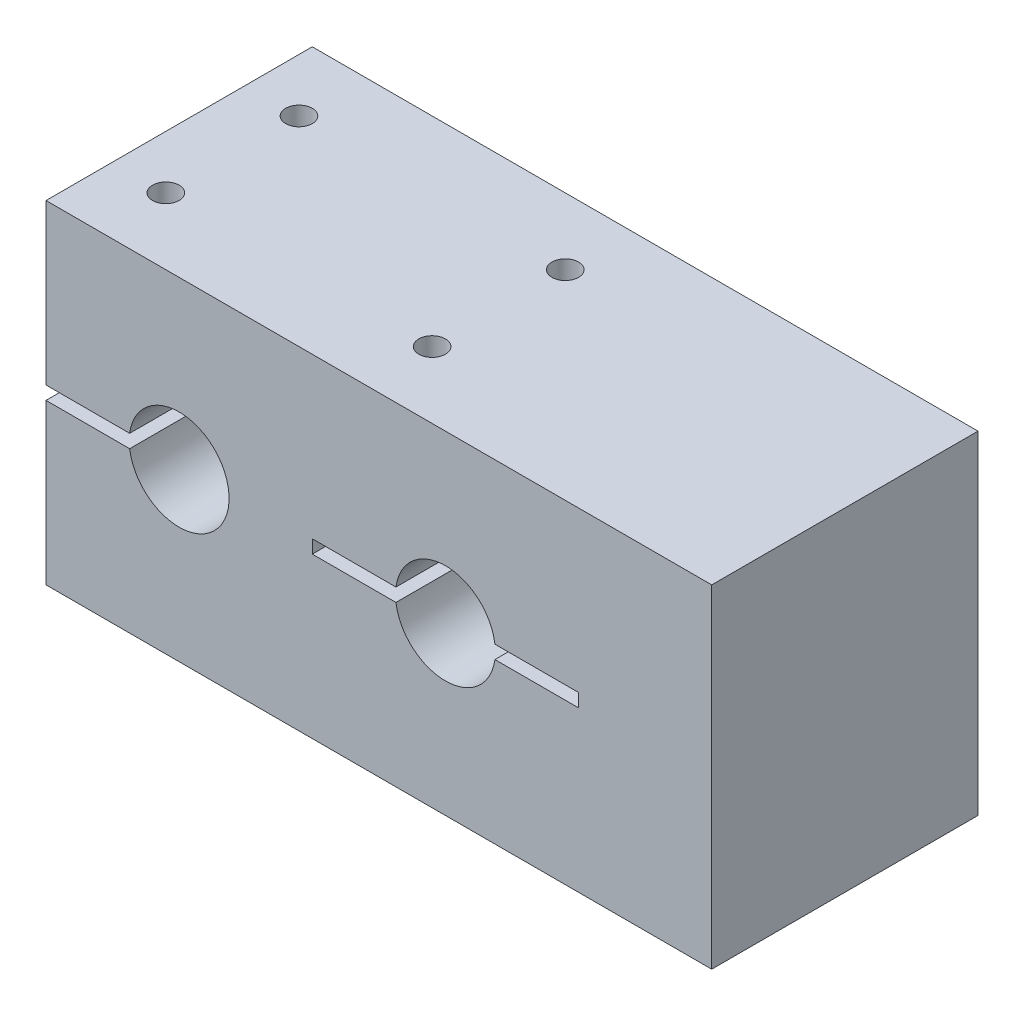
ISO-10303-21;
HEADER;
FILE_DESCRIPTION(('STEP AP214'),'2;1');
FILE_NAME('part.step','',(''),(''),'','','');
FILE_SCHEMA(('AUTOMOTIVE_DESIGN { 1 0 10303 214 1 1 1 1 }'));
ENDSEC;
DATA;
#1=APPLICATION_CONTEXT('core data for automotive mechanical design processes');
#2=APPLICATION_PROTOCOL_DEFINITION('international standard','automotive_design',2000,#1);
#3=PRODUCT_CONTEXT('',#1,'mechanical');
#4=PRODUCT('Part','Part','',(#3));
#5=PRODUCT_RELATED_PRODUCT_CATEGORY('part','',(#4));
#6=PRODUCT_DEFINITION_FORMATION('','',#4);
#7=PRODUCT_DEFINITION_CONTEXT('part definition',#1,'design');
#8=PRODUCT_DEFINITION('design','',#6,#7);
#9=PRODUCT_DEFINITION_SHAPE('','',#8);
#10=(LENGTH_UNIT() NAMED_UNIT(*) SI_UNIT(.MILLI.,.METRE.));
#11=(NAMED_UNIT(*) PLANE_ANGLE_UNIT() SI_UNIT($,.RADIAN.));
#12=(NAMED_UNIT(*) SI_UNIT($,.STERADIAN.) SOLID_ANGLE_UNIT());
#13=UNCERTAINTY_MEASURE_WITH_UNIT(LENGTH_MEASURE(1.E-05),#10,'distance_accuracy_value','');
#14=(GEOMETRIC_REPRESENTATION_CONTEXT(3) GLOBAL_UNCERTAINTY_ASSIGNED_CONTEXT((#13)) GLOBAL_UNIT_ASSIGNED_CONTEXT((#10,
#11,#12)) REPRESENTATION_CONTEXT('',''));
#15=CARTESIAN_POINT('',(0.,0.,0.));
#16=DIRECTION('',(0.,0.,1.));
#17=DIRECTION('',(1.,0.,0.));
#18=AXIS2_PLACEMENT_3D('',#15,#16,#17);
#19=CARTESIAN_POINT('',(20.,25.,40.));
#20=DIRECTION('',(0.,0.,1.));
#21=DIRECTION('',(1.,0.,0.));
#22=AXIS2_PLACEMENT_3D('',#19,#20,#21);
#23=PLANE('',#22);
#24=DIRECTION('',(0.,-1.,0.));
#25=VECTOR('',#24,1.);
#26=CARTESIAN_POINT('',(0.,0.,40.));
#27=LINE('',#26,#25);
#28=CARTESIAN_POINT('',(0.,24.,40.));
#29=VERTEX_POINT('',#28);
#30=CARTESIAN_POINT('',(0.,0.,40.));
#31=VERTEX_POINT('',#30);
#32=EDGE_CURVE('E217',#29,#31,#27,.T.);
#33=ORIENTED_EDGE('',*,*,#32,.T.);
#34=DIRECTION('',(1.,0.,0.));
#35=VECTOR('',#34,1.);
#36=CARTESIAN_POINT('',(0.,0.,40.));
#37=LINE('',#36,#35);
#38=CARTESIAN_POINT('',(100.,0.,40.));
#39=VERTEX_POINT('',#38);
#40=EDGE_CURVE('E220',#31,#39,#37,.T.);
#41=ORIENTED_EDGE('',*,*,#40,.T.);
#42=DIRECTION('',(0.,1.,0.));
#43=VECTOR('',#42,1.);
#44=CARTESIAN_POINT('',(100.,0.,40.));
#45=LINE('',#44,#43);
#46=CARTESIAN_POINT('',(100.,50.,40.));
#47=VERTEX_POINT('',#46);
#48=EDGE_CURVE('E223',#39,#47,#45,.T.);
#49=ORIENTED_EDGE('',*,*,#48,.T.);
#50=DIRECTION('',(-1.,0.,0.));
#51=VECTOR('',#50,1.);
#52=CARTESIAN_POINT('',(0.,50.,40.));
#53=LINE('',#52,#51);
#54=CARTESIAN_POINT('',(0.,50.,40.));
#55=VERTEX_POINT('',#54);
#56=EDGE_CURVE('E225',#47,#55,#53,.T.);
#57=ORIENTED_EDGE('',*,*,#56,.T.);
#58=DIRECTION('',(0.,-1.,0.));
#59=VECTOR('',#58,1.);
#60=CARTESIAN_POINT('',(0.,26.,40.));
#61=LINE('',#60,#59);
#62=CARTESIAN_POINT('',(0.,26.,40.));
#63=VERTEX_POINT('',#62);
#64=EDGE_CURVE('E227',#55,#63,#61,.T.);
#65=ORIENTED_EDGE('',*,*,#64,.T.);
#66=DIRECTION('',(1.,0.,0.));
#67=VECTOR('',#66,1.);
#68=CARTESIAN_POINT('',(0.,26.,40.));
#69=LINE('',#68,#67);
#70=CARTESIAN_POINT('',(12.5669656263407,26.,40.));
#71=VERTEX_POINT('',#70);
#72=EDGE_CURVE('E229',#63,#71,#69,.T.);
#73=ORIENTED_EDGE('',*,*,#72,.T.);
#74=CARTESIAN_POINT('',(20.,25.,40.));
#75=DIRECTION('',(0.,0.,-1.));
#76=DIRECTION('',(1.,0.,0.));
#77=AXIS2_PLACEMENT_3D('',#74,#75,#76);
#78=CIRCLE('',#77,7.5);
#79=CARTESIAN_POINT('',(12.5669656263407,24.,40.));
#80=VERTEX_POINT('',#79);
#81=EDGE_CURVE('E231',#71,#80,#78,.T.);
#82=ORIENTED_EDGE('',*,*,#81,.T.);
#83=DIRECTION('',(-1.,0.,0.));
#84=VECTOR('',#83,1.);
#85=CARTESIAN_POINT('',(0.,24.,40.));
#86=LINE('',#85,#84);
#87=EDGE_CURVE('E233',#80,#29,#86,.T.);
#88=ORIENTED_EDGE('',*,*,#87,.T.);
#89=EDGE_LOOP('',(#33,#41,#49,#57,#65,#73,#82,#88));
#90=FACE_BOUND('',#89,.T.);
#91=DIRECTION('',(1.,0.,0.));
#92=VECTOR('',#91,1.);
#93=CARTESIAN_POINT('',(67.4330343736593,24.,40.));
#94=LINE('',#93,#92);
#95=CARTESIAN_POINT('',(67.4330343736593,24.,40.));
#96=VERTEX_POINT('',#95);
#97=CARTESIAN_POINT('',(80.,24.,40.));
#98=VERTEX_POINT('',#97);
#99=EDGE_CURVE('E158',#96,#98,#94,.T.);
#100=ORIENTED_EDGE('',*,*,#99,.F.);
#101=CARTESIAN_POINT('',(60.,25.,40.));
#102=DIRECTION('',(0.,0.,1.));
#103=DIRECTION('',(1.,0.,0.));
#104=AXIS2_PLACEMENT_3D('',#101,#102,#103);
#105=CIRCLE('',#104,7.50000000000001);
#106=CARTESIAN_POINT('',(52.5669656263408,24.,40.));
#107=VERTEX_POINT('',#106);
#108=EDGE_CURVE('E150',#107,#96,#105,.T.);
#109=ORIENTED_EDGE('',*,*,#108,.F.);
#110=DIRECTION('',(1.,0.,0.));
#111=VECTOR('',#110,1.);
#112=CARTESIAN_POINT('',(40.,24.,40.));
#113=LINE('',#112,#111);
#114=CARTESIAN_POINT('',(40.,24.,40.));
#115=VERTEX_POINT('',#114);
#116=EDGE_CURVE('E184',#115,#107,#113,.T.);
#117=ORIENTED_EDGE('',*,*,#116,.F.);
#118=DIRECTION('',(0.,-1.,0.));
#119=VECTOR('',#118,1.);
#120=CARTESIAN_POINT('',(40.,26.,40.));
#121=LINE('',#120,#119);
#122=CARTESIAN_POINT('',(40.,26.,40.));
#123=VERTEX_POINT('',#122);
#124=EDGE_CURVE('E182',#123,#115,#121,.T.);
#125=ORIENTED_EDGE('',*,*,#124,.F.);
#126=DIRECTION('',(-1.,0.,0.));
#127=VECTOR('',#126,1.);
#128=CARTESIAN_POINT('',(52.5669656263407,26.,40.));
#129=LINE('',#128,#127);
#130=CARTESIAN_POINT('',(52.5669656263407,26.,40.));
#131=VERTEX_POINT('',#130);
#132=EDGE_CURVE('E180',#131,#123,#129,.T.);
#133=ORIENTED_EDGE('',*,*,#132,.F.);
#134=CARTESIAN_POINT('',(60.,25.,40.));
#135=DIRECTION('',(0.,0.,1.));
#136=DIRECTION('',(1.,0.,0.));
#137=AXIS2_PLACEMENT_3D('',#134,#135,#136);
#138=CIRCLE('',#137,7.50000000000001);
#139=CARTESIAN_POINT('',(67.4330343736593,26.,40.));
#140=VERTEX_POINT('',#139);
#141=EDGE_CURVE('E178',#140,#131,#138,.T.);
#142=ORIENTED_EDGE('',*,*,#141,.F.);
#143=DIRECTION('',(-1.,0.,0.));
#144=VECTOR('',#143,1.);
#145=CARTESIAN_POINT('',(80.,26.,40.));
#146=LINE('',#145,#144);
#147=CARTESIAN_POINT('',(80.,26.,40.));
#148=VERTEX_POINT('',#147);
#149=EDGE_CURVE('E173',#148,#140,#146,.T.);
#150=ORIENTED_EDGE('',*,*,#149,.F.);
#151=DIRECTION('',(0.,1.,0.));
#152=VECTOR('',#151,1.);
#153=CARTESIAN_POINT('',(80.,24.,40.));
#154=LINE('',#153,#152);
#155=EDGE_CURVE('E171',#98,#148,#154,.T.);
#156=ORIENTED_EDGE('',*,*,#155,.F.);
#157=EDGE_LOOP('',(#100,#109,#117,#125,#133,#142,#150,#156));
#158=FACE_BOUND('',#157,.T.);
#159=ADVANCED_FACE('F35',(#90,#158),#23,.T.);
#160=CARTESIAN_POINT('',(20.,25.,0.));
#161=DIRECTION('',(0.,0.,1.));
#162=DIRECTION('',(1.,0.,0.));
#163=AXIS2_PLACEMENT_3D('',#160,#161,#162);
#164=PLANE('',#163);
#165=DIRECTION('',(0.,-1.,0.));
#166=VECTOR('',#165,1.);
#167=CARTESIAN_POINT('',(0.,0.,0.));
#168=LINE('',#167,#166);
#169=CARTESIAN_POINT('',(0.,24.,0.));
#170=VERTEX_POINT('',#169);
#171=CARTESIAN_POINT('',(0.,0.,0.));
#172=VERTEX_POINT('',#171);
#173=EDGE_CURVE('E166',#170,#172,#168,.T.);
#174=ORIENTED_EDGE('',*,*,#173,.F.);
#175=DIRECTION('',(-1.,0.,0.));
#176=VECTOR('',#175,1.);
#177=CARTESIAN_POINT('',(0.,24.,0.));
#178=LINE('',#177,#176);
#179=CARTESIAN_POINT('',(12.5669656263407,24.,0.));
#180=VERTEX_POINT('',#179);
#181=EDGE_CURVE('E221',#180,#170,#178,.T.);
#182=ORIENTED_EDGE('',*,*,#181,.F.);
#183=CARTESIAN_POINT('',(20.,25.,0.));
#184=DIRECTION('',(0.,0.,-1.));
#185=DIRECTION('',(1.,0.,0.));
#186=AXIS2_PLACEMENT_3D('',#183,#184,#185);
#187=CIRCLE('',#186,7.5);
#188=CARTESIAN_POINT('',(12.5669656263407,26.,0.));
#189=VERTEX_POINT('',#188);
#190=EDGE_CURVE('E249',#189,#180,#187,.T.);
#191=ORIENTED_EDGE('',*,*,#190,.F.);
#192=DIRECTION('',(1.,0.,0.));
#193=VECTOR('',#192,1.);
#194=CARTESIAN_POINT('',(0.,26.,0.));
#195=LINE('',#194,#193);
#196=CARTESIAN_POINT('',(0.,26.,0.));
#197=VERTEX_POINT('',#196);
#198=EDGE_CURVE('E247',#197,#189,#195,.T.);
#199=ORIENTED_EDGE('',*,*,#198,.F.);
#200=DIRECTION('',(0.,-1.,0.));
#201=VECTOR('',#200,1.);
#202=CARTESIAN_POINT('',(0.,26.,0.));
#203=LINE('',#202,#201);
#204=CARTESIAN_POINT('',(0.,50.,0.));
#205=VERTEX_POINT('',#204);
#206=EDGE_CURVE('E245',#205,#197,#203,.T.);
#207=ORIENTED_EDGE('',*,*,#206,.F.);
#208=DIRECTION('',(-1.,0.,0.));
#209=VECTOR('',#208,1.);
#210=CARTESIAN_POINT('',(0.,50.,0.));
#211=LINE('',#210,#209);
#212=CARTESIAN_POINT('',(100.,50.,0.));
#213=VERTEX_POINT('',#212);
#214=EDGE_CURVE('E243',#213,#205,#211,.T.);
#215=ORIENTED_EDGE('',*,*,#214,.F.);
#216=DIRECTION('',(0.,1.,0.));
#217=VECTOR('',#216,1.);
#218=CARTESIAN_POINT('',(100.,34.,0.));
#219=LINE('',#218,#217);
#220=CARTESIAN_POINT('',(100.,0.,0.));
#221=VERTEX_POINT('',#220);
#222=EDGE_CURVE('E241',#221,#213,#219,.T.);
#223=ORIENTED_EDGE('',*,*,#222,.F.);
#224=DIRECTION('',(1.,0.,0.));
#225=VECTOR('',#224,1.);
#226=CARTESIAN_POINT('',(0.,0.,0.));
#227=LINE('',#226,#225);
#228=EDGE_CURVE('E238',#172,#221,#227,.T.);
#229=ORIENTED_EDGE('',*,*,#228,.F.);
#230=EDGE_LOOP('',(#174,#182,#191,#199,#207,#215,#223,#229));
#231=FACE_BOUND('',#230,.T.);
#232=CARTESIAN_POINT('',(60.,25.,0.));
#233=DIRECTION('',(0.,0.,1.));
#234=DIRECTION('',(1.,0.,0.));
#235=AXIS2_PLACEMENT_3D('',#232,#233,#234);
#236=CIRCLE('',#235,7.50000000000001);
#237=CARTESIAN_POINT('',(52.5669656263408,24.,0.));
#238=VERTEX_POINT('',#237);
#239=CARTESIAN_POINT('',(67.4330343736593,24.,0.));
#240=VERTEX_POINT('',#239);
#241=EDGE_CURVE('E60',#238,#240,#236,.T.);
#242=ORIENTED_EDGE('',*,*,#241,.T.);
#243=DIRECTION('',(1.,0.,0.));
#244=VECTOR('',#243,1.);
#245=CARTESIAN_POINT('',(67.4330343736593,24.,0.));
#246=LINE('',#245,#244);
#247=CARTESIAN_POINT('',(80.,24.,0.));
#248=VERTEX_POINT('',#247);
#249=EDGE_CURVE('E165',#240,#248,#246,.T.);
#250=ORIENTED_EDGE('',*,*,#249,.T.);
#251=DIRECTION('',(0.,1.,0.));
#252=VECTOR('',#251,1.);
#253=CARTESIAN_POINT('',(80.,24.,0.));
#254=LINE('',#253,#252);
#255=CARTESIAN_POINT('',(80.,26.,0.));
#256=VERTEX_POINT('',#255);
#257=EDGE_CURVE('E189',#248,#256,#254,.T.);
#258=ORIENTED_EDGE('',*,*,#257,.T.);
#259=DIRECTION('',(-1.,0.,0.));
#260=VECTOR('',#259,1.);
#261=CARTESIAN_POINT('',(80.,26.,0.));
#262=LINE('',#261,#260);
#263=CARTESIAN_POINT('',(67.4330343736593,26.,0.));
#264=VERTEX_POINT('',#263);
#265=EDGE_CURVE('E192',#256,#264,#262,.T.);
#266=ORIENTED_EDGE('',*,*,#265,.T.);
#267=CARTESIAN_POINT('',(60.,25.,0.));
#268=DIRECTION('',(0.,0.,1.));
#269=DIRECTION('',(1.,0.,0.));
#270=AXIS2_PLACEMENT_3D('',#267,#268,#269);
#271=CIRCLE('',#270,7.50000000000001);
#272=CARTESIAN_POINT('',(52.5669656263407,26.,0.));
#273=VERTEX_POINT('',#272);
#274=EDGE_CURVE('E195',#264,#273,#271,.T.);
#275=ORIENTED_EDGE('',*,*,#274,.T.);
#276=DIRECTION('',(-1.,0.,0.));
#277=VECTOR('',#276,1.);
#278=CARTESIAN_POINT('',(52.5669656263407,26.,0.));
#279=LINE('',#278,#277);
#280=CARTESIAN_POINT('',(40.,26.,0.));
#281=VERTEX_POINT('',#280);
#282=EDGE_CURVE('E198',#273,#281,#279,.T.);
#283=ORIENTED_EDGE('',*,*,#282,.T.);
#284=DIRECTION('',(0.,-1.,0.));
#285=VECTOR('',#284,1.);
#286=CARTESIAN_POINT('',(40.,26.,0.));
#287=LINE('',#286,#285);
#288=CARTESIAN_POINT('',(40.,24.,0.));
#289=VERTEX_POINT('',#288);
#290=EDGE_CURVE('E201',#281,#289,#287,.T.);
#291=ORIENTED_EDGE('',*,*,#290,.T.);
#292=DIRECTION('',(1.,0.,0.));
#293=VECTOR('',#292,1.);
#294=CARTESIAN_POINT('',(40.,24.,0.));
#295=LINE('',#294,#293);
#296=EDGE_CURVE('E159',#289,#238,#295,.T.);
#297=ORIENTED_EDGE('',*,*,#296,.T.);
#298=EDGE_LOOP('',(#242,#250,#258,#266,#275,#283,#291,#297));
#299=FACE_BOUND('',#298,.T.);
#300=ADVANCED_FACE('F333',(#231,#299),#164,.F.);
#301=CARTESIAN_POINT('',(0.,0.,40.));
#302=DIRECTION('',(1.,0.,0.));
#303=DIRECTION('',(0.,1.,0.));
#304=AXIS2_PLACEMENT_3D('',#301,#302,#303);
#305=PLANE('',#304);
#306=ORIENTED_EDGE('',*,*,#173,.T.);
#307=DIRECTION('',(0.,0.,-1.));
#308=VECTOR('',#307,1.);
#309=CARTESIAN_POINT('',(0.,0.,40.));
#310=LINE('',#309,#308);
#311=EDGE_CURVE('E11',#31,#172,#310,.T.);
#312=ORIENTED_EDGE('',*,*,#311,.F.);
#313=ORIENTED_EDGE('',*,*,#32,.F.);
#314=DIRECTION('',(0.,0.,-1.));
#315=VECTOR('',#314,1.);
#316=CARTESIAN_POINT('',(0.,24.,40.));
#317=LINE('',#316,#315);
#318=EDGE_CURVE('E235',#29,#170,#317,.T.);
#319=ORIENTED_EDGE('',*,*,#318,.T.);
#320=EDGE_LOOP('',(#306,#312,#313,#319));
#321=FACE_BOUND('',#320,.T.);
#322=ADVANCED_FACE('F37',(#321),#305,.F.);
#323=CARTESIAN_POINT('',(0.,0.,40.));
#324=DIRECTION('',(0.,1.,0.));
#325=DIRECTION('',(0.,0.,1.));
#326=AXIS2_PLACEMENT_3D('',#323,#324,#325);
#327=PLANE('',#326);
#328=CARTESIAN_POINT('',(48.,0.,10.));
#329=DIRECTION('',(0.,-1.,0.));
#330=DIRECTION('',(0.,0.,-1.));
#331=AXIS2_PLACEMENT_3D('',#328,#329,#330);
#332=CIRCLE('',#331,2.);
#333=CARTESIAN_POINT('',(48.,0.,8.));
#334=VERTEX_POINT('',#333);
#335=EDGE_CURVE('E376',#334,#334,#332,.T.);
#336=ORIENTED_EDGE('',*,*,#335,.F.);
#337=EDGE_LOOP('',(#336));
#338=FACE_BOUND('',#337,.T.);
#339=CARTESIAN_POINT('',(48.,0.,30.));
#340=DIRECTION('',(0.,-1.,0.));
#341=DIRECTION('',(0.,0.,-1.));
#342=AXIS2_PLACEMENT_3D('',#339,#340,#341);
#343=CIRCLE('',#342,2.);
#344=CARTESIAN_POINT('',(48.,0.,28.));
#345=VERTEX_POINT('',#344);
#346=EDGE_CURVE('E289',#345,#345,#343,.T.);
#347=ORIENTED_EDGE('',*,*,#346,.F.);
#348=EDGE_LOOP('',(#347));
#349=FACE_BOUND('',#348,.T.);
#350=CARTESIAN_POINT('',(8.,0.,10.));
#351=DIRECTION('',(0.,-1.,0.));
#352=DIRECTION('',(0.,0.,-1.));
#353=AXIS2_PLACEMENT_3D('',#350,#351,#352);
#354=CIRCLE('',#353,2.);
#355=CARTESIAN_POINT('',(8.,0.,8.));
#356=VERTEX_POINT('',#355);
#357=EDGE_CURVE('E286',#356,#356,#354,.T.);
#358=ORIENTED_EDGE('',*,*,#357,.F.);
#359=EDGE_LOOP('',(#358));
#360=FACE_BOUND('',#359,.T.);
#361=CARTESIAN_POINT('',(8.,0.,30.));
#362=DIRECTION('',(0.,-1.,0.));
#363=DIRECTION('',(0.,0.,-1.));
#364=AXIS2_PLACEMENT_3D('',#361,#362,#363);
#365=CIRCLE('',#364,2.);
#366=CARTESIAN_POINT('',(8.,0.,28.));
#367=VERTEX_POINT('',#366);
#368=EDGE_CURVE('E305',#367,#367,#365,.T.);
#369=ORIENTED_EDGE('',*,*,#368,.F.);
#370=EDGE_LOOP('',(#369));
#371=FACE_BOUND('',#370,.T.);
#372=ORIENTED_EDGE('',*,*,#228,.T.);
#373=DIRECTION('',(0.,0.,-1.));
#374=VECTOR('',#373,1.);
#375=CARTESIAN_POINT('',(100.,0.,40.));
#376=LINE('',#375,#374);
#377=EDGE_CURVE('E44',#39,#221,#376,.T.);
#378=ORIENTED_EDGE('',*,*,#377,.F.);
#379=ORIENTED_EDGE('',*,*,#40,.F.);
#380=ORIENTED_EDGE('',*,*,#311,.T.);
#381=EDGE_LOOP('',(#372,#378,#379,#380));
#382=FACE_BOUND('',#381,.T.);
#383=ADVANCED_FACE('F365',(#338,#349,#360,#371,#382),#327,.F.);
#384=CARTESIAN_POINT('',(100.,34.,40.));
#385=DIRECTION('',(-1.,0.,0.));
#386=DIRECTION('',(0.,0.,1.));
#387=AXIS2_PLACEMENT_3D('',#384,#385,#386);
#388=PLANE('',#387);
#389=ORIENTED_EDGE('',*,*,#222,.T.);
#390=DIRECTION('',(0.,0.,-1.));
#391=VECTOR('',#390,1.);
#392=CARTESIAN_POINT('',(100.,50.,40.));
#393=LINE('',#392,#391);
#394=EDGE_CURVE('E266',#47,#213,#393,.T.);
#395=ORIENTED_EDGE('',*,*,#394,.F.);
#396=ORIENTED_EDGE('',*,*,#48,.F.);
#397=ORIENTED_EDGE('',*,*,#377,.T.);
#398=EDGE_LOOP('',(#389,#395,#396,#397));
#399=FACE_BOUND('',#398,.T.);
#400=ADVANCED_FACE('F362',(#399),#388,.F.);
#401=CARTESIAN_POINT('',(0.,50.,40.));
#402=DIRECTION('',(0.,-1.,0.));
#403=DIRECTION('',(0.,0.,-1.));
#404=AXIS2_PLACEMENT_3D('',#401,#402,#403);
#405=PLANE('',#404);
#406=CARTESIAN_POINT('',(48.,50.,10.));
#407=DIRECTION('',(0.,-1.,0.));
#408=DIRECTION('',(0.,0.,-1.));
#409=AXIS2_PLACEMENT_3D('',#406,#407,#408);
#410=CIRCLE('',#409,2.);
#411=CARTESIAN_POINT('',(48.,50.,8.));
#412=VERTEX_POINT('',#411);
#413=EDGE_CURVE('E451',#412,#412,#410,.T.);
#414=ORIENTED_EDGE('',*,*,#413,.T.);
#415=EDGE_LOOP('',(#414));
#416=FACE_BOUND('',#415,.T.);
#417=CARTESIAN_POINT('',(48.,50.,30.));
#418=DIRECTION('',(0.,-1.,0.));
#419=DIRECTION('',(0.,0.,-1.));
#420=AXIS2_PLACEMENT_3D('',#417,#418,#419);
#421=CIRCLE('',#420,2.);
#422=CARTESIAN_POINT('',(48.,50.,28.));
#423=VERTEX_POINT('',#422);
#424=EDGE_CURVE('E282',#423,#423,#421,.T.);
#425=ORIENTED_EDGE('',*,*,#424,.T.);
#426=EDGE_LOOP('',(#425));
#427=FACE_BOUND('',#426,.T.);
#428=CARTESIAN_POINT('',(8.,50.,10.));
#429=DIRECTION('',(0.,-1.,0.));
#430=DIRECTION('',(0.,0.,-1.));
#431=AXIS2_PLACEMENT_3D('',#428,#429,#430);
#432=CIRCLE('',#431,2.);
#433=CARTESIAN_POINT('',(8.,50.,8.));
#434=VERTEX_POINT('',#433);
#435=EDGE_CURVE('E278',#434,#434,#432,.T.);
#436=ORIENTED_EDGE('',*,*,#435,.T.);
#437=EDGE_LOOP('',(#436));
#438=FACE_BOUND('',#437,.T.);
#439=CARTESIAN_POINT('',(8.,50.,30.));
#440=DIRECTION('',(0.,-1.,0.));
#441=DIRECTION('',(0.,0.,-1.));
#442=AXIS2_PLACEMENT_3D('',#439,#440,#441);
#443=CIRCLE('',#442,2.);
#444=CARTESIAN_POINT('',(8.,50.,28.));
#445=VERTEX_POINT('',#444);
#446=EDGE_CURVE('E274',#445,#445,#443,.T.);
#447=ORIENTED_EDGE('',*,*,#446,.T.);
#448=EDGE_LOOP('',(#447));
#449=FACE_BOUND('',#448,.T.);
#450=ORIENTED_EDGE('',*,*,#214,.T.);
#451=DIRECTION('',(0.,0.,-1.));
#452=VECTOR('',#451,1.);
#453=CARTESIAN_POINT('',(0.,50.,40.));
#454=LINE('',#453,#452);
#455=EDGE_CURVE('E263',#55,#205,#454,.T.);
#456=ORIENTED_EDGE('',*,*,#455,.F.);
#457=ORIENTED_EDGE('',*,*,#56,.F.);
#458=ORIENTED_EDGE('',*,*,#394,.T.);
#459=EDGE_LOOP('',(#450,#456,#457,#458));
#460=FACE_BOUND('',#459,.T.);
#461=ADVANCED_FACE('F358',(#416,#427,#438,#449,#460),#405,.F.);
#462=CARTESIAN_POINT('',(0.,26.,40.));
#463=DIRECTION('',(1.,0.,0.));
#464=DIRECTION('',(0.,0.,-1.));
#465=AXIS2_PLACEMENT_3D('',#462,#463,#464);
#466=PLANE('',#465);
#467=ORIENTED_EDGE('',*,*,#206,.T.);
#468=DIRECTION('',(0.,0.,-1.));
#469=VECTOR('',#468,1.);
#470=CARTESIAN_POINT('',(0.,26.,40.));
#471=LINE('',#470,#469);
#472=EDGE_CURVE('E260',#63,#197,#471,.T.);
#473=ORIENTED_EDGE('',*,*,#472,.F.);
#474=ORIENTED_EDGE('',*,*,#64,.F.);
#475=ORIENTED_EDGE('',*,*,#455,.T.);
#476=EDGE_LOOP('',(#467,#473,#474,#475));
#477=FACE_BOUND('',#476,.T.);
#478=ADVANCED_FACE('F354',(#477),#466,.F.);
#479=CARTESIAN_POINT('',(0.,26.,40.));
#480=DIRECTION('',(0.,1.,0.));
#481=DIRECTION('',(0.,0.,1.));
#482=AXIS2_PLACEMENT_3D('',#479,#480,#481);
#483=PLANE('',#482);
#484=CARTESIAN_POINT('',(8.,26.,10.));
#485=DIRECTION('',(0.,1.,0.));
#486=DIRECTION('',(0.,0.,1.));
#487=AXIS2_PLACEMENT_3D('',#484,#485,#486);
#488=CIRCLE('',#487,2.);
#489=CARTESIAN_POINT('',(8.,26.,12.));
#490=VERTEX_POINT('',#489);
#491=EDGE_CURVE('E277',#490,#490,#488,.T.);
#492=ORIENTED_EDGE('',*,*,#491,.T.);
#493=EDGE_LOOP('',(#492));
#494=FACE_BOUND('',#493,.T.);
#495=CARTESIAN_POINT('',(8.,26.,30.));
#496=DIRECTION('',(0.,1.,0.));
#497=DIRECTION('',(0.,0.,1.));
#498=AXIS2_PLACEMENT_3D('',#495,#496,#497);
#499=CIRCLE('',#498,2.);
#500=CARTESIAN_POINT('',(8.,26.,32.));
#501=VERTEX_POINT('',#500);
#502=EDGE_CURVE('E187',#501,#501,#499,.T.);
#503=ORIENTED_EDGE('',*,*,#502,.T.);
#504=EDGE_LOOP('',(#503));
#505=FACE_BOUND('',#504,.T.);
#506=ORIENTED_EDGE('',*,*,#198,.T.);
#507=DIRECTION('',(0.,0.,-1.));
#508=VECTOR('',#507,1.);
#509=CARTESIAN_POINT('',(12.5669656263407,26.,40.));
#510=LINE('',#509,#508);
#511=EDGE_CURVE('E257',#71,#189,#510,.T.);
#512=ORIENTED_EDGE('',*,*,#511,.F.);
#513=ORIENTED_EDGE('',*,*,#72,.F.);
#514=ORIENTED_EDGE('',*,*,#472,.T.);
#515=EDGE_LOOP('',(#506,#512,#513,#514));
#516=FACE_BOUND('',#515,.T.);
#517=ADVANCED_FACE('F312',(#494,#505,#516),#483,.F.);
#518=CARTESIAN_POINT('',(20.,25.,40.));
#519=DIRECTION('',(0.,0.,-1.));
#520=DIRECTION('',(-1.,0.,0.));
#521=AXIS2_PLACEMENT_3D('',#518,#519,#520);
#522=CYLINDRICAL_SURFACE('',#521,7.5);
#523=ORIENTED_EDGE('',*,*,#190,.T.);
#524=DIRECTION('',(0.,0.,-1.));
#525=VECTOR('',#524,1.);
#526=CARTESIAN_POINT('',(12.5669656263407,24.,40.));
#527=LINE('',#526,#525);
#528=EDGE_CURVE('E254',#80,#180,#527,.T.);
#529=ORIENTED_EDGE('',*,*,#528,.F.);
#530=ORIENTED_EDGE('',*,*,#81,.F.);
#531=ORIENTED_EDGE('',*,*,#511,.T.);
#532=EDGE_LOOP('',(#523,#529,#530,#531));
#533=FACE_BOUND('',#532,.T.);
#534=ADVANCED_FACE('F347',(#533),#522,.F.);
#535=CARTESIAN_POINT('',(0.,24.,40.));
#536=DIRECTION('',(0.,-1.,0.));
#537=DIRECTION('',(0.,0.,-1.));
#538=AXIS2_PLACEMENT_3D('',#535,#536,#537);
#539=PLANE('',#538);
#540=CARTESIAN_POINT('',(8.,24.,10.));
#541=DIRECTION('',(0.,-1.,0.));
#542=DIRECTION('',(0.,0.,-1.));
#543=AXIS2_PLACEMENT_3D('',#540,#541,#542);
#544=CIRCLE('',#543,2.);
#545=CARTESIAN_POINT('',(8.,24.,8.));
#546=VERTEX_POINT('',#545);
#547=EDGE_CURVE('E275',#546,#546,#544,.T.);
#548=ORIENTED_EDGE('',*,*,#547,.T.);
#549=EDGE_LOOP('',(#548));
#550=FACE_BOUND('',#549,.T.);
#551=CARTESIAN_POINT('',(8.,24.,30.));
#552=DIRECTION('',(0.,-1.,0.));
#553=DIRECTION('',(0.,0.,-1.));
#554=AXIS2_PLACEMENT_3D('',#551,#552,#553);
#555=CIRCLE('',#554,2.);
#556=CARTESIAN_POINT('',(8.,24.,28.));
#557=VERTEX_POINT('',#556);
#558=EDGE_CURVE('E271',#557,#557,#555,.T.);
#559=ORIENTED_EDGE('',*,*,#558,.T.);
#560=EDGE_LOOP('',(#559));
#561=FACE_BOUND('',#560,.T.);
#562=ORIENTED_EDGE('',*,*,#181,.T.);
#563=ORIENTED_EDGE('',*,*,#318,.F.);
#564=ORIENTED_EDGE('',*,*,#87,.F.);
#565=ORIENTED_EDGE('',*,*,#528,.T.);
#566=EDGE_LOOP('',(#562,#563,#564,#565));
#567=FACE_BOUND('',#566,.T.);
#568=ADVANCED_FACE('F344',(#550,#561,#567),#539,.F.);
#569=CARTESIAN_POINT('',(60.,25.,40.));
#570=DIRECTION('',(0.,0.,-1.));
#571=DIRECTION('',(-1.,0.,0.));
#572=AXIS2_PLACEMENT_3D('',#569,#570,#571);
#573=CYLINDRICAL_SURFACE('',#572,7.50000000000001);
#574=ORIENTED_EDGE('',*,*,#241,.F.);
#575=DIRECTION('',(0.,0.,-1.));
#576=VECTOR('',#575,1.);
#577=CARTESIAN_POINT('',(52.5669656263408,24.,40.));
#578=LINE('',#577,#576);
#579=EDGE_CURVE('E154',#107,#238,#578,.T.);
#580=ORIENTED_EDGE('',*,*,#579,.F.);
#581=ORIENTED_EDGE('',*,*,#108,.T.);
#582=DIRECTION('',(0.,0.,-1.));
#583=VECTOR('',#582,1.);
#584=CARTESIAN_POINT('',(67.4330343736593,24.,40.));
#585=LINE('',#584,#583);
#586=EDGE_CURVE('E153',#96,#240,#585,.T.);
#587=ORIENTED_EDGE('',*,*,#586,.T.);
#588=EDGE_LOOP('',(#574,#580,#581,#587));
#589=FACE_BOUND('',#588,.T.);
#590=ADVANCED_FACE('F152',(#589),#573,.F.);
#591=CARTESIAN_POINT('',(67.4330343736593,24.,40.));
#592=DIRECTION('',(0.,1.,0.));
#593=DIRECTION('',(0.,0.,1.));
#594=AXIS2_PLACEMENT_3D('',#591,#592,#593);
#595=PLANE('',#594);
#596=ORIENTED_EDGE('',*,*,#249,.F.);
#597=ORIENTED_EDGE('',*,*,#586,.F.);
#598=ORIENTED_EDGE('',*,*,#99,.T.);
#599=DIRECTION('',(0.,0.,-1.));
#600=VECTOR('',#599,1.);
#601=CARTESIAN_POINT('',(80.,24.,40.));
#602=LINE('',#601,#600);
#603=EDGE_CURVE('E167',#98,#248,#602,.T.);
#604=ORIENTED_EDGE('',*,*,#603,.T.);
#605=EDGE_LOOP('',(#596,#597,#598,#604));
#606=FACE_BOUND('',#605,.T.);
#607=ADVANCED_FACE('F162',(#606),#595,.T.);
#608=CARTESIAN_POINT('',(80.,24.,40.));
#609=DIRECTION('',(-1.,0.,0.));
#610=DIRECTION('',(0.,0.,1.));
#611=AXIS2_PLACEMENT_3D('',#608,#609,#610);
#612=PLANE('',#611);
#613=ORIENTED_EDGE('',*,*,#257,.F.);
#614=ORIENTED_EDGE('',*,*,#603,.F.);
#615=ORIENTED_EDGE('',*,*,#155,.T.);
#616=DIRECTION('',(0.,0.,-1.));
#617=VECTOR('',#616,1.);
#618=CARTESIAN_POINT('',(80.,26.,40.));
#619=LINE('',#618,#617);
#620=EDGE_CURVE('E214',#148,#256,#619,.T.);
#621=ORIENTED_EDGE('',*,*,#620,.T.);
#622=EDGE_LOOP('',(#613,#614,#615,#621));
#623=FACE_BOUND('',#622,.T.);
#624=ADVANCED_FACE('F428',(#623),#612,.T.);
#625=CARTESIAN_POINT('',(80.,26.,40.));
#626=DIRECTION('',(0.,-1.,0.));
#627=DIRECTION('',(1.,0.,0.));
#628=AXIS2_PLACEMENT_3D('',#625,#626,#627);
#629=PLANE('',#628);
#630=ORIENTED_EDGE('',*,*,#265,.F.);
#631=ORIENTED_EDGE('',*,*,#620,.F.);
#632=ORIENTED_EDGE('',*,*,#149,.T.);
#633=DIRECTION('',(0.,0.,-1.));
#634=VECTOR('',#633,1.);
#635=CARTESIAN_POINT('',(67.4330343736593,26.,40.));
#636=LINE('',#635,#634);
#637=EDGE_CURVE('E212',#140,#264,#636,.T.);
#638=ORIENTED_EDGE('',*,*,#637,.T.);
#639=EDGE_LOOP('',(#630,#631,#632,#638));
#640=FACE_BOUND('',#639,.T.);
#641=ADVANCED_FACE('F425',(#640),#629,.T.);
#642=CARTESIAN_POINT('',(60.,25.,40.));
#643=DIRECTION('',(0.,0.,-1.));
#644=DIRECTION('',(-1.,0.,0.));
#645=AXIS2_PLACEMENT_3D('',#642,#643,#644);
#646=CYLINDRICAL_SURFACE('',#645,7.50000000000001);
#647=ORIENTED_EDGE('',*,*,#274,.F.);
#648=ORIENTED_EDGE('',*,*,#637,.F.);
#649=ORIENTED_EDGE('',*,*,#141,.T.);
#650=DIRECTION('',(0.,0.,-1.));
#651=VECTOR('',#650,1.);
#652=CARTESIAN_POINT('',(52.5669656263407,26.,40.));
#653=LINE('',#652,#651);
#654=EDGE_CURVE('E210',#131,#273,#653,.T.);
#655=ORIENTED_EDGE('',*,*,#654,.T.);
#656=EDGE_LOOP('',(#647,#648,#649,#655));
#657=FACE_BOUND('',#656,.T.);
#658=ADVANCED_FACE('F420',(#657),#646,.F.);
#659=CARTESIAN_POINT('',(52.5669656263407,26.,40.));
#660=DIRECTION('',(0.,-1.,0.));
#661=DIRECTION('',(1.,0.,0.));
#662=AXIS2_PLACEMENT_3D('',#659,#660,#661);
#663=PLANE('',#662);
#664=CARTESIAN_POINT('',(48.,26.,10.));
#665=DIRECTION('',(0.,-1.,0.));
#666=DIRECTION('',(1.,0.,0.));
#667=AXIS2_PLACEMENT_3D('',#664,#665,#666);
#668=CIRCLE('',#667,2.);
#669=CARTESIAN_POINT('',(50.,26.,10.));
#670=VERTEX_POINT('',#669);
#671=EDGE_CURVE('E294',#670,#670,#668,.T.);
#672=ORIENTED_EDGE('',*,*,#671,.F.);
#673=EDGE_LOOP('',(#672));
#674=FACE_BOUND('',#673,.T.);
#675=CARTESIAN_POINT('',(48.,26.,30.));
#676=DIRECTION('',(0.,-1.,0.));
#677=DIRECTION('',(1.,0.,0.));
#678=AXIS2_PLACEMENT_3D('',#675,#676,#677);
#679=CIRCLE('',#678,2.);
#680=CARTESIAN_POINT('',(50.,26.,30.));
#681=VERTEX_POINT('',#680);
#682=EDGE_CURVE('E281',#681,#681,#679,.T.);
#683=ORIENTED_EDGE('',*,*,#682,.F.);
#684=EDGE_LOOP('',(#683));
#685=FACE_BOUND('',#684,.T.);
#686=ORIENTED_EDGE('',*,*,#282,.F.);
#687=ORIENTED_EDGE('',*,*,#654,.F.);
#688=ORIENTED_EDGE('',*,*,#132,.T.);
#689=DIRECTION('',(0.,0.,-1.));
#690=VECTOR('',#689,1.);
#691=CARTESIAN_POINT('',(40.,26.,40.));
#692=LINE('',#691,#690);
#693=EDGE_CURVE('E208',#123,#281,#692,.T.);
#694=ORIENTED_EDGE('',*,*,#693,.T.);
#695=EDGE_LOOP('',(#686,#687,#688,#694));
#696=FACE_BOUND('',#695,.T.);
#697=ADVANCED_FACE('F416',(#674,#685,#696),#663,.T.);
#698=CARTESIAN_POINT('',(40.,26.,40.));
#699=DIRECTION('',(1.,0.,0.));
#700=DIRECTION('',(0.,1.,0.));
#701=AXIS2_PLACEMENT_3D('',#698,#699,#700);
#702=PLANE('',#701);
#703=ORIENTED_EDGE('',*,*,#290,.F.);
#704=ORIENTED_EDGE('',*,*,#693,.F.);
#705=ORIENTED_EDGE('',*,*,#124,.T.);
#706=DIRECTION('',(0.,0.,-1.));
#707=VECTOR('',#706,1.);
#708=CARTESIAN_POINT('',(40.,24.,40.));
#709=LINE('',#708,#707);
#710=EDGE_CURVE('E52',#115,#289,#709,.T.);
#711=ORIENTED_EDGE('',*,*,#710,.T.);
#712=EDGE_LOOP('',(#703,#704,#705,#711));
#713=FACE_BOUND('',#712,.T.);
#714=ADVANCED_FACE('F413',(#713),#702,.T.);
#715=CARTESIAN_POINT('',(40.,24.,40.));
#716=DIRECTION('',(0.,1.,0.));
#717=DIRECTION('',(0.,0.,1.));
#718=AXIS2_PLACEMENT_3D('',#715,#716,#717);
#719=PLANE('',#718);
#720=CARTESIAN_POINT('',(48.,24.,10.));
#721=DIRECTION('',(0.,1.,0.));
#722=DIRECTION('',(0.,0.,1.));
#723=AXIS2_PLACEMENT_3D('',#720,#721,#722);
#724=CIRCLE('',#723,2.);
#725=CARTESIAN_POINT('',(48.,24.,12.));
#726=VERTEX_POINT('',#725);
#727=EDGE_CURVE('E39',#726,#726,#724,.T.);
#728=ORIENTED_EDGE('',*,*,#727,.F.);
#729=EDGE_LOOP('',(#728));
#730=FACE_BOUND('',#729,.T.);
#731=CARTESIAN_POINT('',(48.,24.,30.));
#732=DIRECTION('',(0.,1.,0.));
#733=DIRECTION('',(0.,0.,1.));
#734=AXIS2_PLACEMENT_3D('',#731,#732,#733);
#735=CIRCLE('',#734,2.);
#736=CARTESIAN_POINT('',(48.,24.,32.));
#737=VERTEX_POINT('',#736);
#738=EDGE_CURVE('E279',#737,#737,#735,.T.);
#739=ORIENTED_EDGE('',*,*,#738,.F.);
#740=EDGE_LOOP('',(#739));
#741=FACE_BOUND('',#740,.T.);
#742=ORIENTED_EDGE('',*,*,#296,.F.);
#743=ORIENTED_EDGE('',*,*,#710,.F.);
#744=ORIENTED_EDGE('',*,*,#116,.T.);
#745=ORIENTED_EDGE('',*,*,#579,.T.);
#746=EDGE_LOOP('',(#742,#743,#744,#745));
#747=FACE_BOUND('',#746,.T.);
#748=ADVANCED_FACE('F328',(#730,#741,#747),#719,.T.);
#749=CARTESIAN_POINT('',(8.,50.,30.));
#750=DIRECTION('',(0.,-1.,0.));
#751=DIRECTION('',(0.,0.,-1.));
#752=AXIS2_PLACEMENT_3D('',#749,#750,#751);
#753=CYLINDRICAL_SURFACE('',#752,2.);
#754=ORIENTED_EDGE('',*,*,#368,.T.);
#755=EDGE_LOOP('',(#754));
#756=FACE_BOUND('',#755,.T.);
#757=ORIENTED_EDGE('',*,*,#558,.F.);
#758=EDGE_LOOP('',(#757));
#759=FACE_BOUND('',#758,.T.);
#760=ADVANCED_FACE('F318',(#756,#759),#753,.F.);
#761=ORIENTED_EDGE('',*,*,#446,.F.);
#762=EDGE_LOOP('',(#761));
#763=FACE_BOUND('',#762,.T.);
#764=ORIENTED_EDGE('',*,*,#502,.F.);
#765=EDGE_LOOP('',(#764));
#766=FACE_BOUND('',#765,.T.);
#767=ADVANCED_FACE('F315',(#763,#766),#753,.F.);
#768=CARTESIAN_POINT('',(8.,50.,10.));
#769=DIRECTION('',(0.,-1.,0.));
#770=DIRECTION('',(0.,0.,-1.));
#771=AXIS2_PLACEMENT_3D('',#768,#769,#770);
#772=CYLINDRICAL_SURFACE('',#771,2.);
#773=ORIENTED_EDGE('',*,*,#357,.T.);
#774=EDGE_LOOP('',(#773));
#775=FACE_BOUND('',#774,.T.);
#776=ORIENTED_EDGE('',*,*,#547,.F.);
#777=EDGE_LOOP('',(#776));
#778=FACE_BOUND('',#777,.T.);
#779=ADVANCED_FACE('F317',(#775,#778),#772,.F.);
#780=ORIENTED_EDGE('',*,*,#435,.F.);
#781=EDGE_LOOP('',(#780));
#782=FACE_BOUND('',#781,.T.);
#783=ORIENTED_EDGE('',*,*,#491,.F.);
#784=EDGE_LOOP('',(#783));
#785=FACE_BOUND('',#784,.T.);
#786=ADVANCED_FACE('F325',(#782,#785),#772,.F.);
#787=CARTESIAN_POINT('',(48.,50.,30.));
#788=DIRECTION('',(0.,-1.,0.));
#789=DIRECTION('',(0.,0.,-1.));
#790=AXIS2_PLACEMENT_3D('',#787,#788,#789);
#791=CYLINDRICAL_SURFACE('',#790,2.);
#792=ORIENTED_EDGE('',*,*,#738,.T.);
#793=EDGE_LOOP('',(#792));
#794=FACE_BOUND('',#793,.T.);
#795=ORIENTED_EDGE('',*,*,#346,.T.);
#796=EDGE_LOOP('',(#795));
#797=FACE_BOUND('',#796,.T.);
#798=ADVANCED_FACE('F467',(#794,#797),#791,.F.);
#799=ORIENTED_EDGE('',*,*,#682,.T.);
#800=EDGE_LOOP('',(#799));
#801=FACE_BOUND('',#800,.T.);
#802=ORIENTED_EDGE('',*,*,#424,.F.);
#803=EDGE_LOOP('',(#802));
#804=FACE_BOUND('',#803,.T.);
#805=ADVANCED_FACE('F460',(#801,#804),#791,.F.);
#806=CARTESIAN_POINT('',(48.,50.,10.));
#807=DIRECTION('',(0.,-1.,0.));
#808=DIRECTION('',(0.,0.,-1.));
#809=AXIS2_PLACEMENT_3D('',#806,#807,#808);
#810=CYLINDRICAL_SURFACE('',#809,2.);
#811=ORIENTED_EDGE('',*,*,#727,.T.);
#812=EDGE_LOOP('',(#811));
#813=FACE_BOUND('',#812,.T.);
#814=ORIENTED_EDGE('',*,*,#335,.T.);
#815=EDGE_LOOP('',(#814));
#816=FACE_BOUND('',#815,.T.);
#817=ADVANCED_FACE('F457',(#813,#816),#810,.F.);
#818=ORIENTED_EDGE('',*,*,#671,.T.);
#819=EDGE_LOOP('',(#818));
#820=FACE_BOUND('',#819,.T.);
#821=ORIENTED_EDGE('',*,*,#413,.F.);
#822=EDGE_LOOP('',(#821));
#823=FACE_BOUND('',#822,.T.);
#824=ADVANCED_FACE('F459',(#820,#823),#810,.F.);
#825=CLOSED_SHELL('',(#159,#300,#322,#383,#400,#461,#478,#517,#534,#568,#590,#607,#624,#641,
#658,#697,#714,#748,#760,#767,#779,#786,#798,#805,#817,#824));
#826=MANIFOLD_SOLID_BREP('B2',#825);
#827=ADVANCED_BREP_SHAPE_REPRESENTATION('',(#18,#826),#14);
#828=SHAPE_DEFINITION_REPRESENTATION(#9,#827);
ENDSEC;
END-ISO-10303-21;
